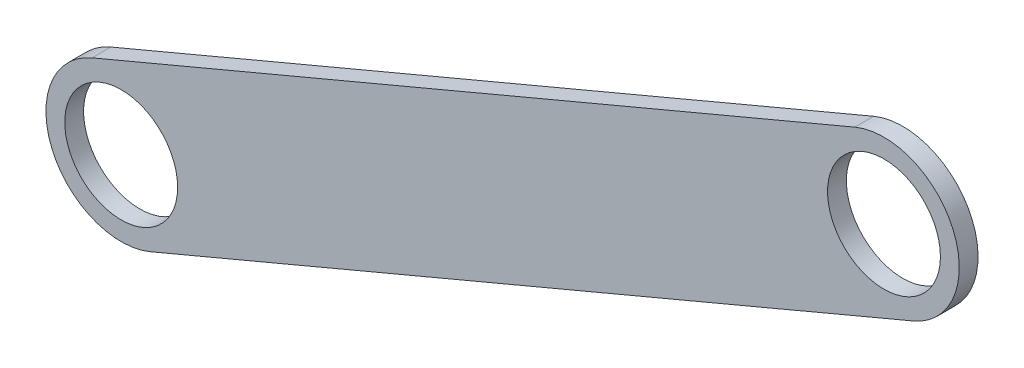
ISO-10303-21;
HEADER;
FILE_DESCRIPTION(('STEP AP214'),'2;1');
FILE_NAME('part.step','',(''),(''),'','','');
FILE_SCHEMA(('AUTOMOTIVE_DESIGN { 1 0 10303 214 1 1 1 1 }'));
ENDSEC;
DATA;
#1=APPLICATION_CONTEXT('core data for automotive mechanical design processes');
#2=APPLICATION_PROTOCOL_DEFINITION('international standard','automotive_design',2000,#1);
#3=PRODUCT_CONTEXT('',#1,'mechanical');
#4=PRODUCT('Part','Part','',(#3));
#5=PRODUCT_RELATED_PRODUCT_CATEGORY('part','',(#4));
#6=PRODUCT_DEFINITION_FORMATION('','',#4);
#7=PRODUCT_DEFINITION_CONTEXT('part definition',#1,'design');
#8=PRODUCT_DEFINITION('design','',#6,#7);
#9=PRODUCT_DEFINITION_SHAPE('','',#8);
#10=(LENGTH_UNIT() NAMED_UNIT(*) SI_UNIT(.MILLI.,.METRE.));
#11=(NAMED_UNIT(*) PLANE_ANGLE_UNIT() SI_UNIT($,.RADIAN.));
#12=(NAMED_UNIT(*) SI_UNIT($,.STERADIAN.) SOLID_ANGLE_UNIT());
#13=UNCERTAINTY_MEASURE_WITH_UNIT(LENGTH_MEASURE(1.E-05),#10,'distance_accuracy_value','');
#14=(GEOMETRIC_REPRESENTATION_CONTEXT(3) GLOBAL_UNCERTAINTY_ASSIGNED_CONTEXT((#13)) GLOBAL_UNIT_ASSIGNED_CONTEXT((#10,
#11,#12)) REPRESENTATION_CONTEXT('',''));
#15=CARTESIAN_POINT('',(0.,0.,0.));
#16=DIRECTION('',(0.,0.,1.));
#17=DIRECTION('',(1.,0.,0.));
#18=AXIS2_PLACEMENT_3D('',#15,#16,#17);
#19=CARTESIAN_POINT('',(33.4032663433047,22.0818593411446,1.));
#20=DIRECTION('',(0.,0.,1.));
#21=DIRECTION('',(1.,0.,0.));
#22=AXIS2_PLACEMENT_3D('',#19,#20,#21);
#23=PLANE('',#22);
#24=CARTESIAN_POINT('',(33.4032663433047,22.0818593411446,1.));
#25=DIRECTION('',(0.,0.,1.));
#26=DIRECTION('',(1.,0.,0.));
#27=AXIS2_PLACEMENT_3D('',#24,#25,#26);
#28=CIRCLE('',#27,2.99999999999999);
#29=CARTESIAN_POINT('',(36.4032663433047,22.0818593411446,1.));
#30=VERTEX_POINT('',#29);
#31=EDGE_CURVE('E108',#30,#30,#28,.T.);
#32=ORIENTED_EDGE('',*,*,#31,.F.);
#33=EDGE_LOOP('',(#32));
#34=FACE_BOUND('',#33,.T.);
#35=CARTESIAN_POINT('',(33.4032663433047,22.0818593411446,1.));
#36=DIRECTION('',(0.,0.,1.));
#37=DIRECTION('',(1.,0.,0.));
#38=AXIS2_PLACEMENT_3D('',#35,#36,#37);
#39=CIRCLE('',#38,3.99999999999998);
#40=CARTESIAN_POINT('',(34.9564329319018,18.3957131763722,1.));
#41=VERTEX_POINT('',#40);
#42=CARTESIAN_POINT('',(31.8500997547077,25.7680055059169,1.));
#43=VERTEX_POINT('',#42);
#44=EDGE_CURVE('E93',#41,#43,#39,.T.);
#45=ORIENTED_EDGE('',*,*,#44,.T.);
#46=DIRECTION('',(-0.921536541193083,-0.388291647149265,0.));
#47=VECTOR('',#46,1.);
#48=CARTESIAN_POINT('',(31.8500997547077,25.7680055059169,1.));
#49=LINE('',#48,#47);
#50=CARTESIAN_POINT('',(-8.69750805778799,8.68317303134922,1.));
#51=VERTEX_POINT('',#50);
#52=EDGE_CURVE('E88',#43,#51,#49,.T.);
#53=ORIENTED_EDGE('',*,*,#52,.T.);
#54=CARTESIAN_POINT('',(-7.14434146919093,4.99702686657689,1.));
#55=DIRECTION('',(0.,0.,1.));
#56=DIRECTION('',(1.,0.,0.));
#57=AXIS2_PLACEMENT_3D('',#54,#55,#56);
#58=CIRCLE('',#57,4.);
#59=CARTESIAN_POINT('',(-5.59117488059387,1.31088070180455,1.));
#60=VERTEX_POINT('',#59);
#61=EDGE_CURVE('E91',#51,#60,#58,.T.);
#62=ORIENTED_EDGE('',*,*,#61,.T.);
#63=DIRECTION('',(0.921536541193083,0.388291647149266,0.));
#64=VECTOR('',#63,1.);
#65=CARTESIAN_POINT('',(34.9564329319018,18.3957131763722,1.));
#66=LINE('',#65,#64);
#67=EDGE_CURVE('E58',#60,#41,#66,.T.);
#68=ORIENTED_EDGE('',*,*,#67,.T.);
#69=EDGE_LOOP('',(#45,#53,#62,#68));
#70=FACE_BOUND('',#69,.T.);
#71=CARTESIAN_POINT('',(-7.14434146919093,4.99702686657689,1.));
#72=DIRECTION('',(0.,0.,1.));
#73=DIRECTION('',(1.,0.,0.));
#74=AXIS2_PLACEMENT_3D('',#71,#72,#73);
#75=CIRCLE('',#74,3.);
#76=CARTESIAN_POINT('',(-4.14434146919093,4.99702686657689,1.));
#77=VERTEX_POINT('',#76);
#78=EDGE_CURVE('E123',#77,#77,#75,.T.);
#79=ORIENTED_EDGE('',*,*,#78,.F.);
#80=EDGE_LOOP('',(#79));
#81=FACE_BOUND('',#80,.T.);
#82=ADVANCED_FACE('F41',(#34,#70,#81),#23,.T.);
#83=CARTESIAN_POINT('',(33.4032663433047,22.0818593411446,0.));
#84=DIRECTION('',(0.,0.,1.));
#85=DIRECTION('',(1.,0.,0.));
#86=AXIS2_PLACEMENT_3D('',#83,#84,#85);
#87=PLANE('',#86);
#88=CARTESIAN_POINT('',(33.4032663433047,22.0818593411446,0.));
#89=DIRECTION('',(0.,0.,1.));
#90=DIRECTION('',(1.,0.,0.));
#91=AXIS2_PLACEMENT_3D('',#88,#89,#90);
#92=CIRCLE('',#91,3.99999999999998);
#93=CARTESIAN_POINT('',(34.9564329319018,18.3957131763722,0.));
#94=VERTEX_POINT('',#93);
#95=CARTESIAN_POINT('',(31.8500997547077,25.7680055059169,0.));
#96=VERTEX_POINT('',#95);
#97=EDGE_CURVE('E105',#94,#96,#92,.T.);
#98=ORIENTED_EDGE('',*,*,#97,.F.);
#99=DIRECTION('',(0.921536541193083,0.388291647149266,0.));
#100=VECTOR('',#99,1.);
#101=CARTESIAN_POINT('',(34.9564329319018,18.3957131763722,0.));
#102=LINE('',#101,#100);
#103=CARTESIAN_POINT('',(-5.59117488059387,1.31088070180455,0.));
#104=VERTEX_POINT('',#103);
#105=EDGE_CURVE('E81',#104,#94,#102,.T.);
#106=ORIENTED_EDGE('',*,*,#105,.F.);
#107=CARTESIAN_POINT('',(-7.14434146919093,4.99702686657689,0.));
#108=DIRECTION('',(0.,0.,1.));
#109=DIRECTION('',(1.,0.,0.));
#110=AXIS2_PLACEMENT_3D('',#107,#108,#109);
#111=CIRCLE('',#110,4.);
#112=CARTESIAN_POINT('',(-8.69750805778799,8.68317303134922,0.));
#113=VERTEX_POINT('',#112);
#114=EDGE_CURVE('E75',#113,#104,#111,.T.);
#115=ORIENTED_EDGE('',*,*,#114,.F.);
#116=DIRECTION('',(-0.921536541193083,-0.388291647149265,0.));
#117=VECTOR('',#116,1.);
#118=CARTESIAN_POINT('',(31.8500997547077,25.7680055059169,0.));
#119=LINE('',#118,#117);
#120=EDGE_CURVE('E97',#96,#113,#119,.T.);
#121=ORIENTED_EDGE('',*,*,#120,.F.);
#122=EDGE_LOOP('',(#98,#106,#115,#121));
#123=FACE_BOUND('',#122,.T.);
#124=CARTESIAN_POINT('',(33.4032663433047,22.0818593411446,0.));
#125=DIRECTION('',(0.,0.,1.));
#126=DIRECTION('',(1.,0.,0.));
#127=AXIS2_PLACEMENT_3D('',#124,#125,#126);
#128=CIRCLE('',#127,2.99999999999999);
#129=CARTESIAN_POINT('',(36.4032663433047,22.0818593411446,0.));
#130=VERTEX_POINT('',#129);
#131=EDGE_CURVE('E120',#130,#130,#128,.T.);
#132=ORIENTED_EDGE('',*,*,#131,.T.);
#133=EDGE_LOOP('',(#132));
#134=FACE_BOUND('',#133,.T.);
#135=CARTESIAN_POINT('',(-7.14434146919093,4.99702686657689,0.));
#136=DIRECTION('',(0.,0.,1.));
#137=DIRECTION('',(1.,0.,0.));
#138=AXIS2_PLACEMENT_3D('',#135,#136,#137);
#139=CIRCLE('',#138,3.);
#140=CARTESIAN_POINT('',(-4.14434146919093,4.99702686657689,0.));
#141=VERTEX_POINT('',#140);
#142=EDGE_CURVE('E126',#141,#141,#139,.T.);
#143=ORIENTED_EDGE('',*,*,#142,.T.);
#144=EDGE_LOOP('',(#143));
#145=FACE_BOUND('',#144,.T.);
#146=ADVANCED_FACE('F116',(#123,#134,#145),#87,.F.);
#147=CARTESIAN_POINT('',(33.4032663433047,22.0818593411446,1.));
#148=DIRECTION('',(0.,0.,-1.));
#149=DIRECTION('',(-1.,0.,0.));
#150=AXIS2_PLACEMENT_3D('',#147,#148,#149);
#151=CYLINDRICAL_SURFACE('',#150,3.99999999999998);
#152=ORIENTED_EDGE('',*,*,#97,.T.);
#153=DIRECTION('',(0.,0.,-1.));
#154=VECTOR('',#153,1.);
#155=CARTESIAN_POINT('',(31.8500997547077,25.7680055059169,1.));
#156=LINE('',#155,#154);
#157=EDGE_CURVE('E11',#43,#96,#156,.T.);
#158=ORIENTED_EDGE('',*,*,#157,.F.);
#159=ORIENTED_EDGE('',*,*,#44,.F.);
#160=DIRECTION('',(0.,0.,-1.));
#161=VECTOR('',#160,1.);
#162=CARTESIAN_POINT('',(34.9564329319018,18.3957131763722,1.));
#163=LINE('',#162,#161);
#164=EDGE_CURVE('E101',#41,#94,#163,.T.);
#165=ORIENTED_EDGE('',*,*,#164,.T.);
#166=EDGE_LOOP('',(#152,#158,#159,#165));
#167=FACE_BOUND('',#166,.T.);
#168=ADVANCED_FACE('F43',(#167),#151,.T.);
#169=CARTESIAN_POINT('',(31.8500997547077,25.7680055059169,1.));
#170=DIRECTION('',(0.388291647149265,-0.921536541193083,0.));
#171=DIRECTION('',(0.921536541193083,0.388291647149265,0.));
#172=AXIS2_PLACEMENT_3D('',#169,#170,#171);
#173=PLANE('',#172);
#174=ORIENTED_EDGE('',*,*,#120,.T.);
#175=DIRECTION('',(0.,0.,-1.));
#176=VECTOR('',#175,1.);
#177=CARTESIAN_POINT('',(-8.69750805778799,8.68317303134922,1.));
#178=LINE('',#177,#176);
#179=EDGE_CURVE('E50',#51,#113,#178,.T.);
#180=ORIENTED_EDGE('',*,*,#179,.F.);
#181=ORIENTED_EDGE('',*,*,#52,.F.);
#182=ORIENTED_EDGE('',*,*,#157,.T.);
#183=EDGE_LOOP('',(#174,#180,#181,#182));
#184=FACE_BOUND('',#183,.T.);
#185=ADVANCED_FACE('F96',(#184),#173,.F.);
#186=CARTESIAN_POINT('',(-7.14434146919093,4.99702686657689,1.));
#187=DIRECTION('',(0.,0.,-1.));
#188=DIRECTION('',(-1.,0.,0.));
#189=AXIS2_PLACEMENT_3D('',#186,#187,#188);
#190=CYLINDRICAL_SURFACE('',#189,4.);
#191=ORIENTED_EDGE('',*,*,#114,.T.);
#192=DIRECTION('',(0.,0.,-1.));
#193=VECTOR('',#192,1.);
#194=CARTESIAN_POINT('',(-5.59117488059387,1.31088070180455,1.));
#195=LINE('',#194,#193);
#196=EDGE_CURVE('E98',#60,#104,#195,.T.);
#197=ORIENTED_EDGE('',*,*,#196,.F.);
#198=ORIENTED_EDGE('',*,*,#61,.F.);
#199=ORIENTED_EDGE('',*,*,#179,.T.);
#200=EDGE_LOOP('',(#191,#197,#198,#199));
#201=FACE_BOUND('',#200,.T.);
#202=ADVANCED_FACE('F99',(#201),#190,.T.);
#203=CARTESIAN_POINT('',(34.9564329319018,18.3957131763722,1.));
#204=DIRECTION('',(-0.388291647149266,0.921536541193083,0.));
#205=DIRECTION('',(-0.921536541193083,-0.388291647149266,0.));
#206=AXIS2_PLACEMENT_3D('',#203,#204,#205);
#207=PLANE('',#206);
#208=ORIENTED_EDGE('',*,*,#105,.T.);
#209=ORIENTED_EDGE('',*,*,#164,.F.);
#210=ORIENTED_EDGE('',*,*,#67,.F.);
#211=ORIENTED_EDGE('',*,*,#196,.T.);
#212=EDGE_LOOP('',(#208,#209,#210,#211));
#213=FACE_BOUND('',#212,.T.);
#214=ADVANCED_FACE('F113',(#213),#207,.F.);
#215=CARTESIAN_POINT('',(33.4032663433047,22.0818593411446,1.));
#216=DIRECTION('',(0.,0.,-1.));
#217=DIRECTION('',(-1.,0.,0.));
#218=AXIS2_PLACEMENT_3D('',#215,#216,#217);
#219=CYLINDRICAL_SURFACE('',#218,2.99999999999999);
#220=ORIENTED_EDGE('',*,*,#31,.T.);
#221=EDGE_LOOP('',(#220));
#222=FACE_BOUND('',#221,.T.);
#223=ORIENTED_EDGE('',*,*,#131,.F.);
#224=EDGE_LOOP('',(#223));
#225=FACE_BOUND('',#224,.T.);
#226=ADVANCED_FACE('F143',(#222,#225),#219,.F.);
#227=CARTESIAN_POINT('',(-7.14434146919093,4.99702686657689,1.));
#228=DIRECTION('',(0.,0.,-1.));
#229=DIRECTION('',(-1.,0.,0.));
#230=AXIS2_PLACEMENT_3D('',#227,#228,#229);
#231=CYLINDRICAL_SURFACE('',#230,3.);
#232=ORIENTED_EDGE('',*,*,#78,.T.);
#233=EDGE_LOOP('',(#232));
#234=FACE_BOUND('',#233,.T.);
#235=ORIENTED_EDGE('',*,*,#142,.F.);
#236=EDGE_LOOP('',(#235));
#237=FACE_BOUND('',#236,.T.);
#238=ADVANCED_FACE('F132',(#234,#237),#231,.F.);
#239=CLOSED_SHELL('',(#82,#146,#168,#185,#202,#214,#226,#238));
#240=MANIFOLD_SOLID_BREP('B2',#239);
#241=ADVANCED_BREP_SHAPE_REPRESENTATION('',(#18,#240),#14);
#242=SHAPE_DEFINITION_REPRESENTATION(#9,#241);
ENDSEC;
END-ISO-10303-21;
